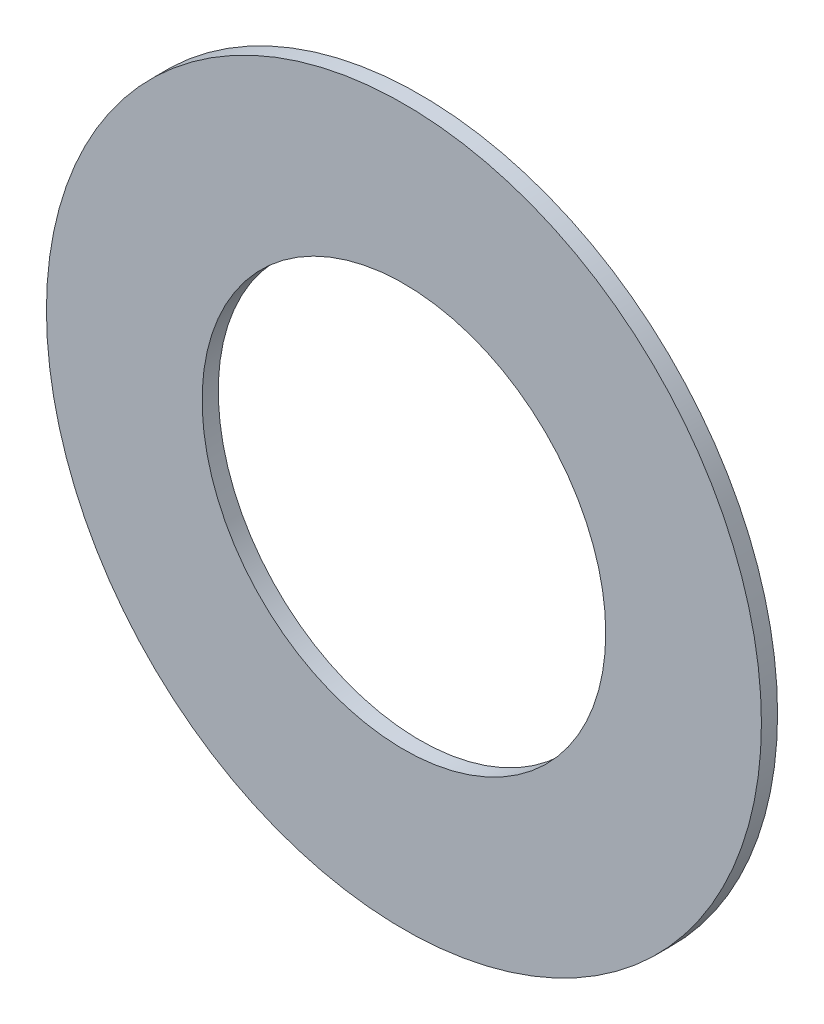
ISO-10303-21;
HEADER;
FILE_DESCRIPTION(('STEP AP214'),'2;1');
FILE_NAME('part.step','',(''),(''),'','','');
FILE_SCHEMA(('AUTOMOTIVE_DESIGN { 1 0 10303 214 1 1 1 1 }'));
ENDSEC;
DATA;
#1=APPLICATION_CONTEXT('core data for automotive mechanical design processes');
#2=APPLICATION_PROTOCOL_DEFINITION('international standard','automotive_design',2000,#1);
#3=PRODUCT_CONTEXT('',#1,'mechanical');
#4=PRODUCT('Part','Part','',(#3));
#5=PRODUCT_RELATED_PRODUCT_CATEGORY('part','',(#4));
#6=PRODUCT_DEFINITION_FORMATION('','',#4);
#7=PRODUCT_DEFINITION_CONTEXT('part definition',#1,'design');
#8=PRODUCT_DEFINITION('design','',#6,#7);
#9=PRODUCT_DEFINITION_SHAPE('','',#8);
#10=(LENGTH_UNIT() NAMED_UNIT(*) SI_UNIT(.MILLI.,.METRE.));
#11=(NAMED_UNIT(*) PLANE_ANGLE_UNIT() SI_UNIT($,.RADIAN.));
#12=(NAMED_UNIT(*) SI_UNIT($,.STERADIAN.) SOLID_ANGLE_UNIT());
#13=UNCERTAINTY_MEASURE_WITH_UNIT(LENGTH_MEASURE(1.E-05),#10,'distance_accuracy_value','');
#14=(GEOMETRIC_REPRESENTATION_CONTEXT(3) GLOBAL_UNCERTAINTY_ASSIGNED_CONTEXT((#13)) GLOBAL_UNIT_ASSIGNED_CONTEXT((#10,
#11,#12)) REPRESENTATION_CONTEXT('',''));
#15=CARTESIAN_POINT('',(0.,0.,0.));
#16=DIRECTION('',(0.,0.,1.));
#17=DIRECTION('',(1.,0.,0.));
#18=AXIS2_PLACEMENT_3D('',#15,#16,#17);
#19=CARTESIAN_POINT('',(0.,0.,0.));
#20=DIRECTION('',(0.,0.,-1.));
#21=DIRECTION('',(1.,0.,0.));
#22=AXIS2_PLACEMENT_3D('',#19,#20,#21);
#23=CYLINDRICAL_SURFACE('',#22,0.7874);
#24=CARTESIAN_POINT('',(0.,0.,0.03556));
#25=DIRECTION('',(0.,0.,1.));
#26=DIRECTION('',(1.,0.,0.));
#27=AXIS2_PLACEMENT_3D('',#24,#25,#26);
#28=CIRCLE('',#27,0.7874);
#29=CARTESIAN_POINT('',(0.7874,0.,0.03556));
#30=VERTEX_POINT('',#29);
#31=EDGE_CURVE('E11',#30,#30,#28,.T.);
#32=ORIENTED_EDGE('',*,*,#31,.F.);
#33=DIRECTION('',(0.,0.,1.));
#34=VECTOR('',#33,1.);
#35=CARTESIAN_POINT('',(0.7874,0.,0.));
#36=LINE('',#35,#34);
#37=CARTESIAN_POINT('',(0.7874,0.,0.));
#38=VERTEX_POINT('',#37);
#39=EDGE_CURVE('E23',#38,#30,#36,.T.);
#40=ORIENTED_EDGE('',*,*,#39,.F.);
#41=CARTESIAN_POINT('',(0.,0.,0.));
#42=DIRECTION('',(0.,0.,1.));
#43=DIRECTION('',(1.,0.,0.));
#44=AXIS2_PLACEMENT_3D('',#41,#42,#43);
#45=CIRCLE('',#44,0.7874);
#46=EDGE_CURVE('E45',#38,#38,#45,.T.);
#47=ORIENTED_EDGE('',*,*,#46,.T.);
#48=ORIENTED_EDGE('',*,*,#39,.T.);
#49=EDGE_LOOP('',(#32,#40,#47,#48));
#50=FACE_BOUND('',#49,.T.);
#51=ADVANCED_FACE('F16',(#50),#23,.T.);
#52=CARTESIAN_POINT('',(0.,0.,0.));
#53=DIRECTION('',(0.,0.,-1.));
#54=DIRECTION('',(1.,0.,0.));
#55=AXIS2_PLACEMENT_3D('',#52,#53,#54);
#56=CYLINDRICAL_SURFACE('',#55,0.4445);
#57=DIRECTION('',(0.,0.,1.));
#58=VECTOR('',#57,1.);
#59=CARTESIAN_POINT('',(0.4445,0.,0.));
#60=LINE('',#59,#58);
#61=CARTESIAN_POINT('',(0.4445,0.,0.));
#62=VERTEX_POINT('',#61);
#63=CARTESIAN_POINT('',(0.4445,0.,0.03556));
#64=VERTEX_POINT('',#63);
#65=EDGE_CURVE('E39',#62,#64,#60,.T.);
#66=ORIENTED_EDGE('',*,*,#65,.T.);
#67=CARTESIAN_POINT('',(0.,0.,0.03556));
#68=DIRECTION('',(0.,0.,1.));
#69=DIRECTION('',(1.,0.,0.));
#70=AXIS2_PLACEMENT_3D('',#67,#68,#69);
#71=CIRCLE('',#70,0.4445);
#72=EDGE_CURVE('E44',#64,#64,#71,.T.);
#73=ORIENTED_EDGE('',*,*,#72,.T.);
#74=ORIENTED_EDGE('',*,*,#65,.F.);
#75=CARTESIAN_POINT('',(0.,0.,0.));
#76=DIRECTION('',(0.,0.,1.));
#77=DIRECTION('',(1.,0.,0.));
#78=AXIS2_PLACEMENT_3D('',#75,#76,#77);
#79=CIRCLE('',#78,0.4445);
#80=EDGE_CURVE('E42',#62,#62,#79,.T.);
#81=ORIENTED_EDGE('',*,*,#80,.F.);
#82=EDGE_LOOP('',(#66,#73,#74,#81));
#83=FACE_BOUND('',#82,.T.);
#84=ADVANCED_FACE('F41',(#83),#56,.F.);
#85=CARTESIAN_POINT('',(0.,0.,0.));
#86=DIRECTION('',(0.,0.,1.));
#87=DIRECTION('',(1.,0.,0.));
#88=AXIS2_PLACEMENT_3D('',#85,#86,#87);
#89=PLANE('',#88);
#90=ORIENTED_EDGE('',*,*,#46,.F.);
#91=EDGE_LOOP('',(#90));
#92=FACE_BOUND('',#91,.T.);
#93=ORIENTED_EDGE('',*,*,#80,.T.);
#94=EDGE_LOOP('',(#93));
#95=FACE_BOUND('',#94,.T.);
#96=ADVANCED_FACE('F48',(#92,#95),#89,.F.);
#97=CARTESIAN_POINT('',(0.,0.,0.03556));
#98=DIRECTION('',(0.,0.,1.));
#99=DIRECTION('',(1.,0.,0.));
#100=AXIS2_PLACEMENT_3D('',#97,#98,#99);
#101=PLANE('',#100);
#102=ORIENTED_EDGE('',*,*,#31,.T.);
#103=EDGE_LOOP('',(#102));
#104=FACE_BOUND('',#103,.T.);
#105=ORIENTED_EDGE('',*,*,#72,.F.);
#106=EDGE_LOOP('',(#105));
#107=FACE_BOUND('',#106,.T.);
#108=ADVANCED_FACE('F55',(#104,#107),#101,.T.);
#109=CLOSED_SHELL('',(#51,#84,#96,#108));
#110=MANIFOLD_SOLID_BREP('B1',#109);
#111=ADVANCED_BREP_SHAPE_REPRESENTATION('',(#18,#110),#14);
#112=SHAPE_DEFINITION_REPRESENTATION(#9,#111);
ENDSEC;
END-ISO-10303-21;
